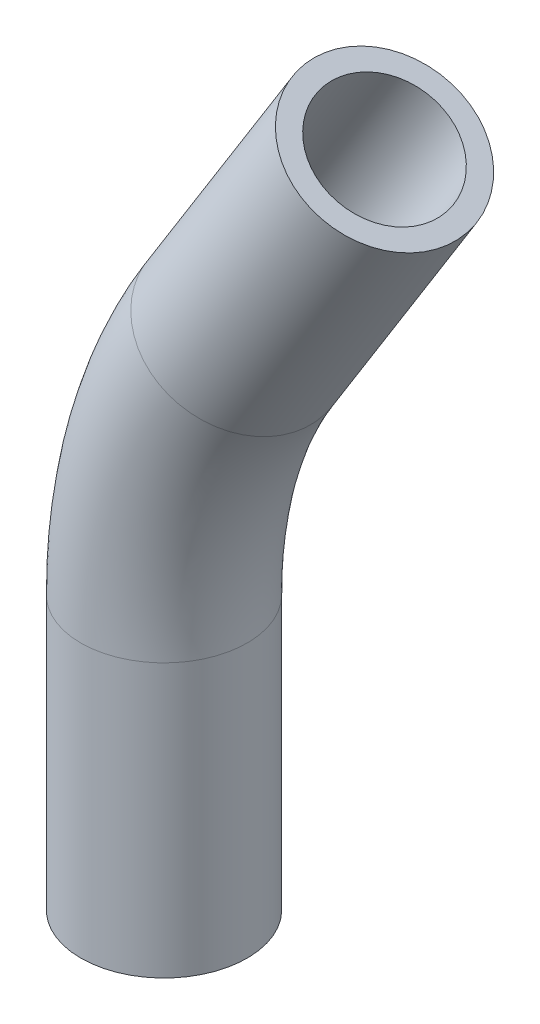
ISO-10303-21;
HEADER;
FILE_DESCRIPTION(('STEP AP214'),'2;1');
FILE_NAME('part.step','',(''),(''),'','','');
FILE_SCHEMA(('AUTOMOTIVE_DESIGN { 1 0 10303 214 1 1 1 1 }'));
ENDSEC;
DATA;
#1=APPLICATION_CONTEXT('core data for automotive mechanical design processes');
#2=APPLICATION_PROTOCOL_DEFINITION('international standard','automotive_design',2000,#1);
#3=PRODUCT_CONTEXT('',#1,'mechanical');
#4=PRODUCT('Part','Part','',(#3));
#5=PRODUCT_RELATED_PRODUCT_CATEGORY('part','',(#4));
#6=PRODUCT_DEFINITION_FORMATION('','',#4);
#7=PRODUCT_DEFINITION_CONTEXT('part definition',#1,'design');
#8=PRODUCT_DEFINITION('design','',#6,#7);
#9=PRODUCT_DEFINITION_SHAPE('','',#8);
#10=(LENGTH_UNIT() NAMED_UNIT(*) SI_UNIT(.MILLI.,.METRE.));
#11=(NAMED_UNIT(*) PLANE_ANGLE_UNIT() SI_UNIT($,.RADIAN.));
#12=(NAMED_UNIT(*) SI_UNIT($,.STERADIAN.) SOLID_ANGLE_UNIT());
#13=UNCERTAINTY_MEASURE_WITH_UNIT(LENGTH_MEASURE(1.E-05),#10,'distance_accuracy_value','');
#14=(GEOMETRIC_REPRESENTATION_CONTEXT(3) GLOBAL_UNCERTAINTY_ASSIGNED_CONTEXT((#13)) GLOBAL_UNIT_ASSIGNED_CONTEXT((#10,
#11,#12)) REPRESENTATION_CONTEXT('',''));
#15=CARTESIAN_POINT('',(0.,0.,0.));
#16=DIRECTION('',(0.,0.,1.));
#17=DIRECTION('',(1.,0.,0.));
#18=AXIS2_PLACEMENT_3D('',#15,#16,#17);
#19=CARTESIAN_POINT('',(0.,0.,0.));
#20=DIRECTION('',(0.,1.,0.));
#21=DIRECTION('',(0.,0.,1.));
#22=AXIS2_PLACEMENT_3D('',#19,#20,#21);
#23=CYLINDRICAL_SURFACE('',#22,4.);
#24=CARTESIAN_POINT('',(0.,13.1181107417886,0.));
#25=DIRECTION('',(0.,1.,0.));
#26=DIRECTION('',(0.,0.,1.));
#27=AXIS2_PLACEMENT_3D('',#24,#25,#26);
#28=CIRCLE('',#27,4.);
#29=CARTESIAN_POINT('',(-4.,13.1181107417886,0.));
#30=VERTEX_POINT('',#29);
#31=EDGE_CURVE('E90',#30,#30,#28,.T.);
#32=ORIENTED_EDGE('',*,*,#31,.F.);
#33=EDGE_LOOP('',(#32));
#34=FACE_BOUND('',#33,.T.);
#35=CARTESIAN_POINT('',(0.,0.,0.));
#36=DIRECTION('',(0.,1.,0.));
#37=DIRECTION('',(0.,0.,1.));
#38=AXIS2_PLACEMENT_3D('',#35,#36,#37);
#39=CIRCLE('',#38,4.);
#40=CARTESIAN_POINT('',(0.,0.,4.));
#41=VERTEX_POINT('',#40);
#42=EDGE_CURVE('E59',#41,#41,#39,.T.);
#43=ORIENTED_EDGE('',*,*,#42,.T.);
#44=EDGE_LOOP('',(#43));
#45=FACE_BOUND('',#44,.T.);
#46=ADVANCED_FACE('F44',(#34,#45),#23,.T.);
#47=CARTESIAN_POINT('',(24.,13.1181107417886,0.));
#48=DIRECTION('',(0.,0.,-1.));
#49=DIRECTION('',(-1.,0.,0.));
#50=AXIS2_PLACEMENT_3D('',#47,#48,#49);
#51=TOROIDAL_SURFACE('',#50,24.,4.);
#52=CARTESIAN_POINT('',(3.64684569224579,25.8361730833855,0.));
#53=DIRECTION('',(0.529919264233206,0.848048096156425,0.));
#54=DIRECTION('',(0.,0.,1.));
#55=AXIS2_PLACEMENT_3D('',#52,#53,#54);
#56=CIRCLE('',#55,4.);
#57=CARTESIAN_POINT('',(0.254653307620093,27.9558501403184,0.));
#58=VERTEX_POINT('',#57);
#59=EDGE_CURVE('E48',#58,#58,#56,.T.);
#60=CARTESIAN_POINT('',(24.,13.1181107417886,0.));
#61=DIRECTION('',(0.,0.,-1.));
#62=DIRECTION('',(-1.,0.,0.));
#63=AXIS2_PLACEMENT_3D('',#60,#61,#62);
#64=CIRCLE('',#63,28.);
#65=EDGE_CURVE('',#30,#58,#64,.T.);
#66=ORIENTED_EDGE('',*,*,#31,.T.);
#67=ORIENTED_EDGE('',*,*,#59,.F.);
#68=ORIENTED_EDGE('',*,*,#65,.T.);
#69=ORIENTED_EDGE('',*,*,#65,.F.);
#70=EDGE_LOOP('',(#66,#68,#67,#69));
#71=FACE_BOUND('',#70,.T.);
#72=ADVANCED_FACE('F98',(#71),#51,.T.);
#73=CARTESIAN_POINT('',(3.6468456922458,25.8361730833855,0.));
#74=DIRECTION('',(0.529919264233206,0.848048096156426,0.));
#75=DIRECTION('',(-0.848048096156426,0.529919264233206,0.));
#76=AXIS2_PLACEMENT_3D('',#73,#74,#75);
#77=CYLINDRICAL_SURFACE('',#76,4.);
#78=CARTESIAN_POINT('',(10.5983852846641,36.9609619231285,0.));
#79=DIRECTION('',(0.529919264233206,0.848048096156426,0.));
#80=DIRECTION('',(0.,0.,1.));
#81=AXIS2_PLACEMENT_3D('',#78,#79,#80);
#82=CIRCLE('',#81,4.);
#83=CARTESIAN_POINT('',(10.5983852846641,36.9609619231285,4.));
#84=VERTEX_POINT('',#83);
#85=EDGE_CURVE('E64',#84,#84,#82,.T.);
#86=ORIENTED_EDGE('',*,*,#85,.F.);
#87=EDGE_LOOP('',(#86));
#88=FACE_BOUND('',#87,.T.);
#89=ORIENTED_EDGE('',*,*,#59,.T.);
#90=EDGE_LOOP('',(#89));
#91=FACE_BOUND('',#90,.T.);
#92=ADVANCED_FACE('F46',(#88,#91),#77,.T.);
#93=CARTESIAN_POINT('',(0.,0.,0.));
#94=DIRECTION('',(0.,1.,0.));
#95=DIRECTION('',(0.,0.,1.));
#96=AXIS2_PLACEMENT_3D('',#93,#94,#95);
#97=PLANE('',#96);
#98=CARTESIAN_POINT('',(0.,0.,0.));
#99=DIRECTION('',(0.,1.,0.));
#100=DIRECTION('',(0.,0.,1.));
#101=AXIS2_PLACEMENT_3D('',#98,#99,#100);
#102=CIRCLE('',#101,3.);
#103=CARTESIAN_POINT('',(0.,0.,3.));
#104=VERTEX_POINT('',#103);
#105=EDGE_CURVE('E85',#104,#104,#102,.F.);
#106=ORIENTED_EDGE('',*,*,#105,.F.);
#107=EDGE_LOOP('',(#106));
#108=FACE_BOUND('',#107,.T.);
#109=ORIENTED_EDGE('',*,*,#42,.F.);
#110=EDGE_LOOP('',(#109));
#111=FACE_BOUND('',#110,.T.);
#112=ADVANCED_FACE('F104',(#108,#111),#97,.F.);
#113=CARTESIAN_POINT('',(10.5983852846641,36.9609619231285,0.));
#114=DIRECTION('',(0.529919264233206,0.848048096156426,0.));
#115=DIRECTION('',(0.,0.,1.));
#116=AXIS2_PLACEMENT_3D('',#113,#114,#115);
#117=PLANE('',#116);
#118=CARTESIAN_POINT('',(10.5983852846641,36.9609619231285,0.));
#119=DIRECTION('',(0.529919264233206,0.848048096156426,0.));
#120=DIRECTION('',(0.,0.,1.));
#121=AXIS2_PLACEMENT_3D('',#118,#119,#120);
#122=CIRCLE('',#121,3.);
#123=CARTESIAN_POINT('',(10.5983852846641,36.9609619231285,3.));
#124=VERTEX_POINT('',#123);
#125=EDGE_CURVE('E13',#124,#124,#122,.F.);
#126=ORIENTED_EDGE('',*,*,#125,.T.);
#127=EDGE_LOOP('',(#126));
#128=FACE_BOUND('',#127,.T.);
#129=ORIENTED_EDGE('',*,*,#85,.T.);
#130=EDGE_LOOP('',(#129));
#131=FACE_BOUND('',#130,.T.);
#132=ADVANCED_FACE('F71',(#128,#131),#117,.T.);
#133=CARTESIAN_POINT('',(0.,0.,0.));
#134=DIRECTION('',(0.,1.,0.));
#135=DIRECTION('',(0.,0.,1.));
#136=AXIS2_PLACEMENT_3D('',#133,#134,#135);
#137=CYLINDRICAL_SURFACE('',#136,3.);
#138=CARTESIAN_POINT('',(0.,13.1181107417886,0.));
#139=DIRECTION('',(0.,1.,0.));
#140=DIRECTION('',(0.,0.,1.));
#141=AXIS2_PLACEMENT_3D('',#138,#139,#140);
#142=CIRCLE('',#141,3.);
#143=CARTESIAN_POINT('',(-3.,13.1181107417886,0.));
#144=VERTEX_POINT('',#143);
#145=EDGE_CURVE('E82',#144,#144,#142,.F.);
#146=ORIENTED_EDGE('',*,*,#145,.F.);
#147=EDGE_LOOP('',(#146));
#148=FACE_BOUND('',#147,.T.);
#149=ORIENTED_EDGE('',*,*,#105,.T.);
#150=EDGE_LOOP('',(#149));
#151=FACE_BOUND('',#150,.T.);
#152=ADVANCED_FACE('F112',(#148,#151),#137,.F.);
#153=CARTESIAN_POINT('',(24.,13.1181107417886,0.));
#154=DIRECTION('',(0.,0.,-1.));
#155=DIRECTION('',(-1.,0.,0.));
#156=AXIS2_PLACEMENT_3D('',#153,#154,#155);
#157=TOROIDAL_SURFACE('',#156,24.,3.);
#158=CARTESIAN_POINT('',(3.64684569224579,25.8361730833855,0.));
#159=DIRECTION('',(0.529919264233206,0.848048096156425,0.));
#160=DIRECTION('',(0.,0.,1.));
#161=AXIS2_PLACEMENT_3D('',#158,#159,#160);
#162=CIRCLE('',#161,3.);
#163=CARTESIAN_POINT('',(1.10270140377652,27.4259308760852,0.));
#164=VERTEX_POINT('',#163);
#165=EDGE_CURVE('E53',#164,#164,#162,.F.);
#166=CARTESIAN_POINT('',(24.,13.1181107417886,0.));
#167=DIRECTION('',(0.,0.,-1.));
#168=DIRECTION('',(-1.,0.,0.));
#169=AXIS2_PLACEMENT_3D('',#166,#167,#168);
#170=CIRCLE('',#169,27.);
#171=EDGE_CURVE('',#144,#164,#170,.T.);
#172=ORIENTED_EDGE('',*,*,#145,.T.);
#173=ORIENTED_EDGE('',*,*,#165,.F.);
#174=ORIENTED_EDGE('',*,*,#171,.T.);
#175=ORIENTED_EDGE('',*,*,#171,.F.);
#176=EDGE_LOOP('',(#172,#174,#173,#175));
#177=FACE_BOUND('',#176,.T.);
#178=ADVANCED_FACE('F77',(#177),#157,.F.);
#179=CARTESIAN_POINT('',(3.6468456922458,25.8361730833855,0.));
#180=DIRECTION('',(0.529919264233206,0.848048096156426,0.));
#181=DIRECTION('',(-0.848048096156426,0.529919264233206,0.));
#182=AXIS2_PLACEMENT_3D('',#179,#180,#181);
#183=CYLINDRICAL_SURFACE('',#182,3.);
#184=ORIENTED_EDGE('',*,*,#125,.F.);
#185=EDGE_LOOP('',(#184));
#186=FACE_BOUND('',#185,.T.);
#187=ORIENTED_EDGE('',*,*,#165,.T.);
#188=EDGE_LOOP('',(#187));
#189=FACE_BOUND('',#188,.T.);
#190=ADVANCED_FACE('F74',(#186,#189),#183,.F.);
#191=CLOSED_SHELL('',(#46,#72,#92,#112,#132,#152,#178,#190));
#192=MANIFOLD_SOLID_BREP('B2',#191);
#193=ADVANCED_BREP_SHAPE_REPRESENTATION('',(#18,#192),#14);
#194=SHAPE_DEFINITION_REPRESENTATION(#9,#193);
ENDSEC;
END-ISO-10303-21;
